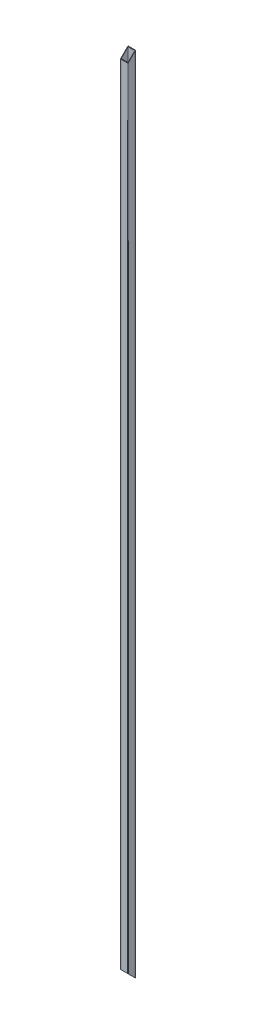
ISO-10303-21;
HEADER;
FILE_DESCRIPTION(('STEP AP214'),'2;1');
FILE_NAME('part.step','',(''),(''),'','','');
FILE_SCHEMA(('AUTOMOTIVE_DESIGN { 1 0 10303 214 1 1 1 1 }'));
ENDSEC;
DATA;
#1=APPLICATION_CONTEXT('core data for automotive mechanical design processes');
#2=APPLICATION_PROTOCOL_DEFINITION('international standard','automotive_design',2000,#1);
#3=PRODUCT_CONTEXT('',#1,'mechanical');
#4=PRODUCT('Part','Part','',(#3));
#5=PRODUCT_RELATED_PRODUCT_CATEGORY('part','',(#4));
#6=PRODUCT_DEFINITION_FORMATION('','',#4);
#7=PRODUCT_DEFINITION_CONTEXT('part definition',#1,'design');
#8=PRODUCT_DEFINITION('design','',#6,#7);
#9=PRODUCT_DEFINITION_SHAPE('','',#8);
#10=(LENGTH_UNIT() NAMED_UNIT(*) SI_UNIT(.MILLI.,.METRE.));
#11=(NAMED_UNIT(*) PLANE_ANGLE_UNIT() SI_UNIT($,.RADIAN.));
#12=(NAMED_UNIT(*) SI_UNIT($,.STERADIAN.) SOLID_ANGLE_UNIT());
#13=UNCERTAINTY_MEASURE_WITH_UNIT(LENGTH_MEASURE(1.E-05),#10,'distance_accuracy_value','');
#14=(GEOMETRIC_REPRESENTATION_CONTEXT(3) GLOBAL_UNCERTAINTY_ASSIGNED_CONTEXT((#13)) GLOBAL_UNIT_ASSIGNED_CONTEXT((#10,
#11,#12)) REPRESENTATION_CONTEXT('',''));
#15=CARTESIAN_POINT('',(0.,0.,0.));
#16=DIRECTION('',(0.,0.,1.));
#17=DIRECTION('',(1.,0.,0.));
#18=AXIS2_PLACEMENT_3D('',#15,#16,#17);
#19=CARTESIAN_POINT('',(16.,4240.,18.));
#20=DIRECTION('',(0.,0.,-1.));
#21=DIRECTION('',(-1.,0.,0.));
#22=AXIS2_PLACEMENT_3D('',#19,#20,#21);
#23=PLANE('',#22);
#24=DIRECTION('',(-1.,0.,0.));
#25=VECTOR('',#24,1.);
#26=CARTESIAN_POINT('',(16.,4202.,18.));
#27=LINE('',#26,#25);
#28=CARTESIAN_POINT('',(16.,4202.,18.));
#29=VERTEX_POINT('',#28);
#30=CARTESIAN_POINT('',(-16.,4202.,18.));
#31=VERTEX_POINT('',#30);
#32=EDGE_CURVE('E11',#29,#31,#27,.T.);
#33=ORIENTED_EDGE('',*,*,#32,.F.);
#34=DIRECTION('',(0.,-1.,0.));
#35=VECTOR('',#34,1.);
#36=CARTESIAN_POINT('',(16.,4240.,18.));
#37=LINE('',#36,#35);
#38=CARTESIAN_POINT('',(16.,38.0000000000003,18.));
#39=VERTEX_POINT('',#38);
#40=EDGE_CURVE('E201',#29,#39,#37,.T.);
#41=ORIENTED_EDGE('',*,*,#40,.T.);
#42=DIRECTION('',(1.,0.,0.));
#43=VECTOR('',#42,1.);
#44=CARTESIAN_POINT('',(16.0000000000004,38.0000000000003,18.));
#45=LINE('',#44,#43);
#46=CARTESIAN_POINT('',(-16.,38.0000000000003,18.));
#47=VERTEX_POINT('',#46);
#48=EDGE_CURVE('E43',#47,#39,#45,.T.);
#49=ORIENTED_EDGE('',*,*,#48,.F.);
#50=DIRECTION('',(0.,-1.,0.));
#51=VECTOR('',#50,1.);
#52=CARTESIAN_POINT('',(-16.,4240.,18.));
#53=LINE('',#52,#51);
#54=EDGE_CURVE('E206',#31,#47,#53,.T.);
#55=ORIENTED_EDGE('',*,*,#54,.F.);
#56=EDGE_LOOP('',(#33,#41,#49,#55));
#57=FACE_BOUND('',#56,.T.);
#58=ADVANCED_FACE('F35',(#57),#23,.T.);
#59=CARTESIAN_POINT('',(-16.,4240.,16.));
#60=DIRECTION('',(0.,-1.,0.));
#61=DIRECTION('',(0.,0.,-1.));
#62=AXIS2_PLACEMENT_3D('',#59,#60,#61);
#63=CYLINDRICAL_SURFACE('',#62,2.);
#64=CARTESIAN_POINT('',(-16.,4204.,16.));
#65=DIRECTION('',(0.,-0.70710678118654,-0.707106781186556));
#66=DIRECTION('',(0.,-0.707106781186556,0.707106781186539));
#67=AXIS2_PLACEMENT_3D('',#64,#65,#66);
#68=ELLIPSE('',#67,2.82842712474622,2.);
#69=CARTESIAN_POINT('',(-18.,4204.,16.));
#70=VERTEX_POINT('',#69);
#71=EDGE_CURVE('E270',#31,#70,#68,.T.);
#72=ORIENTED_EDGE('',*,*,#71,.F.);
#73=ORIENTED_EDGE('',*,*,#54,.T.);
#74=CARTESIAN_POINT('',(-16.,35.9999999999996,16.));
#75=DIRECTION('',(0.,0.707106781186544,-0.707106781186551));
#76=DIRECTION('',(0.,-0.707106781186551,-0.707106781186544));
#77=AXIS2_PLACEMENT_3D('',#74,#75,#76);
#78=ELLIPSE('',#77,2.8284271247462,2.);
#79=CARTESIAN_POINT('',(-18.,35.9999999999996,16.));
#80=VERTEX_POINT('',#79);
#81=EDGE_CURVE('E191',#80,#47,#78,.T.);
#82=ORIENTED_EDGE('',*,*,#81,.F.);
#83=DIRECTION('',(0.,-1.,0.));
#84=VECTOR('',#83,1.);
#85=CARTESIAN_POINT('',(-18.,4240.,16.));
#86=LINE('',#85,#84);
#87=EDGE_CURVE('E209',#70,#80,#86,.T.);
#88=ORIENTED_EDGE('',*,*,#87,.F.);
#89=EDGE_LOOP('',(#72,#73,#82,#88));
#90=FACE_BOUND('',#89,.T.);
#91=ADVANCED_FACE('F309',(#90),#63,.F.);
#92=CARTESIAN_POINT('',(-18.,4240.,16.));
#93=DIRECTION('',(1.,0.,0.));
#94=DIRECTION('',(0.,0.,-1.));
#95=AXIS2_PLACEMENT_3D('',#92,#93,#94);
#96=PLANE('',#95);
#97=DIRECTION('',(0.,0.707106781186556,-0.707106781186539));
#98=VECTOR('',#97,1.);
#99=CARTESIAN_POINT('',(-18.,4222.,-2.00000000000042));
#100=LINE('',#99,#98);
#101=CARTESIAN_POINT('',(-18.,4236.,-16.));
#102=VERTEX_POINT('',#101);
#103=EDGE_CURVE('E272',#70,#102,#100,.T.);
#104=ORIENTED_EDGE('',*,*,#103,.F.);
#105=ORIENTED_EDGE('',*,*,#87,.T.);
#106=DIRECTION('',(0.,0.707106781186551,0.707106781186544));
#107=VECTOR('',#106,1.);
#108=CARTESIAN_POINT('',(-18.,2138.00000000002,2118.));
#109=LINE('',#108,#107);
#110=CARTESIAN_POINT('',(-18.,4.,-16.));
#111=VERTEX_POINT('',#110);
#112=EDGE_CURVE('E258',#111,#80,#109,.T.);
#113=ORIENTED_EDGE('',*,*,#112,.F.);
#114=DIRECTION('',(0.,-1.,0.));
#115=VECTOR('',#114,1.);
#116=CARTESIAN_POINT('',(-18.,4240.,-16.));
#117=LINE('',#116,#115);
#118=EDGE_CURVE('E218',#102,#111,#117,.T.);
#119=ORIENTED_EDGE('',*,*,#118,.F.);
#120=EDGE_LOOP('',(#104,#105,#113,#119));
#121=FACE_BOUND('',#120,.T.);
#122=ADVANCED_FACE('F314',(#121),#96,.T.);
#123=CARTESIAN_POINT('',(-16.,4240.,-16.));
#124=DIRECTION('',(0.,-1.,0.));
#125=DIRECTION('',(0.,0.,-1.));
#126=AXIS2_PLACEMENT_3D('',#123,#124,#125);
#127=CYLINDRICAL_SURFACE('',#126,2.);
#128=CARTESIAN_POINT('',(-16.,4236.,-16.));
#129=DIRECTION('',(0.,-0.70710678118654,-0.707106781186556));
#130=DIRECTION('',(0.,-0.707106781186556,0.707106781186539));
#131=AXIS2_PLACEMENT_3D('',#128,#129,#130);
#132=ELLIPSE('',#131,2.82842712474622,2.);
#133=CARTESIAN_POINT('',(-16.,4238.,-18.));
#134=VERTEX_POINT('',#133);
#135=EDGE_CURVE('E274',#102,#134,#132,.T.);
#136=ORIENTED_EDGE('',*,*,#135,.F.);
#137=ORIENTED_EDGE('',*,*,#118,.T.);
#138=CARTESIAN_POINT('',(-16.,3.99999999999956,-16.));
#139=DIRECTION('',(0.,0.707106781186544,-0.707106781186551));
#140=DIRECTION('',(0.,-0.707106781186551,-0.707106781186544));
#141=AXIS2_PLACEMENT_3D('',#138,#139,#140);
#142=ELLIPSE('',#141,2.8284271247462,2.);
#143=CARTESIAN_POINT('',(-16.,1.99999999999889,-18.));
#144=VERTEX_POINT('',#143);
#145=EDGE_CURVE('E260',#144,#111,#142,.T.);
#146=ORIENTED_EDGE('',*,*,#145,.F.);
#147=DIRECTION('',(0.,-1.,0.));
#148=VECTOR('',#147,1.);
#149=CARTESIAN_POINT('',(-16.,4240.,-18.));
#150=LINE('',#149,#148);
#151=EDGE_CURVE('E221',#134,#144,#150,.T.);
#152=ORIENTED_EDGE('',*,*,#151,.F.);
#153=EDGE_LOOP('',(#136,#137,#146,#152));
#154=FACE_BOUND('',#153,.T.);
#155=ADVANCED_FACE('F320',(#154),#127,.F.);
#156=CARTESIAN_POINT('',(16.,4240.,-18.));
#157=DIRECTION('',(0.,0.,1.));
#158=DIRECTION('',(1.,0.,0.));
#159=AXIS2_PLACEMENT_3D('',#156,#157,#158);
#160=PLANE('',#159);
#161=DIRECTION('',(1.,0.,0.));
#162=VECTOR('',#161,1.);
#163=CARTESIAN_POINT('',(16.,4238.,-18.));
#164=LINE('',#163,#162);
#165=CARTESIAN_POINT('',(16.,4238.,-18.));
#166=VERTEX_POINT('',#165);
#167=EDGE_CURVE('E276',#134,#166,#164,.T.);
#168=ORIENTED_EDGE('',*,*,#167,.F.);
#169=ORIENTED_EDGE('',*,*,#151,.T.);
#170=DIRECTION('',(-1.,0.,0.));
#171=VECTOR('',#170,1.);
#172=CARTESIAN_POINT('',(16.0000000000004,1.99999999999978,-18.));
#173=LINE('',#172,#171);
#174=CARTESIAN_POINT('',(16.,1.99999999999978,-18.));
#175=VERTEX_POINT('',#174);
#176=EDGE_CURVE('E262',#175,#144,#173,.T.);
#177=ORIENTED_EDGE('',*,*,#176,.F.);
#178=DIRECTION('',(0.,-1.,0.));
#179=VECTOR('',#178,1.);
#180=CARTESIAN_POINT('',(16.,4240.,-18.));
#181=LINE('',#180,#179);
#182=EDGE_CURVE('E224',#166,#175,#181,.T.);
#183=ORIENTED_EDGE('',*,*,#182,.F.);
#184=EDGE_LOOP('',(#168,#169,#177,#183));
#185=FACE_BOUND('',#184,.T.);
#186=ADVANCED_FACE('F324',(#185),#160,.T.);
#187=CARTESIAN_POINT('',(16.,4240.,-16.));
#188=DIRECTION('',(0.,-1.,0.));
#189=DIRECTION('',(0.,0.,-1.));
#190=AXIS2_PLACEMENT_3D('',#187,#188,#189);
#191=CYLINDRICAL_SURFACE('',#190,2.);
#192=CARTESIAN_POINT('',(16.,4236.,-16.));
#193=DIRECTION('',(0.,-0.70710678118654,-0.707106781186556));
#194=DIRECTION('',(0.,-0.707106781186556,0.707106781186539));
#195=AXIS2_PLACEMENT_3D('',#192,#193,#194);
#196=ELLIPSE('',#195,2.82842712474622,2.);
#197=CARTESIAN_POINT('',(18.,4236.,-16.));
#198=VERTEX_POINT('',#197);
#199=EDGE_CURVE('E278',#166,#198,#196,.T.);
#200=ORIENTED_EDGE('',*,*,#199,.F.);
#201=ORIENTED_EDGE('',*,*,#182,.T.);
#202=CARTESIAN_POINT('',(16.,3.99999999999956,-16.));
#203=DIRECTION('',(0.,0.707106781186544,-0.707106781186551));
#204=DIRECTION('',(0.,-0.707106781186551,-0.707106781186544));
#205=AXIS2_PLACEMENT_3D('',#202,#203,#204);
#206=ELLIPSE('',#205,2.8284271247462,2.);
#207=CARTESIAN_POINT('',(18.,3.99999999999956,-16.));
#208=VERTEX_POINT('',#207);
#209=EDGE_CURVE('E264',#208,#175,#206,.T.);
#210=ORIENTED_EDGE('',*,*,#209,.F.);
#211=DIRECTION('',(0.,-1.,0.));
#212=VECTOR('',#211,1.);
#213=CARTESIAN_POINT('',(18.,4240.,-16.));
#214=LINE('',#213,#212);
#215=EDGE_CURVE('E227',#198,#208,#214,.T.);
#216=ORIENTED_EDGE('',*,*,#215,.F.);
#217=EDGE_LOOP('',(#200,#201,#210,#216));
#218=FACE_BOUND('',#217,.T.);
#219=ADVANCED_FACE('F328',(#218),#191,.F.);
#220=CARTESIAN_POINT('',(18.,4240.,16.));
#221=DIRECTION('',(-1.,0.,0.));
#222=DIRECTION('',(0.,0.,1.));
#223=AXIS2_PLACEMENT_3D('',#220,#221,#222);
#224=PLANE('',#223);
#225=DIRECTION('',(0.,-0.707106781186556,0.707106781186539));
#226=VECTOR('',#225,1.);
#227=CARTESIAN_POINT('',(18.,4222.,-2.00000000000043));
#228=LINE('',#227,#226);
#229=CARTESIAN_POINT('',(18.,4204.,16.));
#230=VERTEX_POINT('',#229);
#231=EDGE_CURVE('E280',#198,#230,#228,.T.);
#232=ORIENTED_EDGE('',*,*,#231,.F.);
#233=ORIENTED_EDGE('',*,*,#215,.T.);
#234=DIRECTION('',(0.,-0.707106781186551,-0.707106781186544));
#235=VECTOR('',#234,1.);
#236=CARTESIAN_POINT('',(18.,2138.00000000002,2118.));
#237=LINE('',#236,#235);
#238=CARTESIAN_POINT('',(18.,36.,16.));
#239=VERTEX_POINT('',#238);
#240=EDGE_CURVE('E203',#239,#208,#237,.T.);
#241=ORIENTED_EDGE('',*,*,#240,.F.);
#242=DIRECTION('',(0.,-1.,0.));
#243=VECTOR('',#242,1.);
#244=CARTESIAN_POINT('',(18.,4240.,16.));
#245=LINE('',#244,#243);
#246=EDGE_CURVE('E168',#230,#239,#245,.T.);
#247=ORIENTED_EDGE('',*,*,#246,.F.);
#248=EDGE_LOOP('',(#232,#233,#241,#247));
#249=FACE_BOUND('',#248,.T.);
#250=ADVANCED_FACE('F332',(#249),#224,.T.);
#251=CARTESIAN_POINT('',(16.,4240.,16.));
#252=DIRECTION('',(0.,-1.,0.));
#253=DIRECTION('',(0.,0.,-1.));
#254=AXIS2_PLACEMENT_3D('',#251,#252,#253);
#255=CYLINDRICAL_SURFACE('',#254,2.);
#256=CARTESIAN_POINT('',(16.,4204.,16.));
#257=DIRECTION('',(0.,-0.70710678118654,-0.707106781186556));
#258=DIRECTION('',(0.,-0.707106781186556,0.707106781186539));
#259=AXIS2_PLACEMENT_3D('',#256,#257,#258);
#260=ELLIPSE('',#259,2.82842712474622,2.);
#261=EDGE_CURVE('E282',#230,#29,#260,.T.);
#262=ORIENTED_EDGE('',*,*,#261,.F.);
#263=ORIENTED_EDGE('',*,*,#246,.T.);
#264=CARTESIAN_POINT('',(16.,35.9999999999996,16.));
#265=DIRECTION('',(0.,0.707106781186544,-0.707106781186551));
#266=DIRECTION('',(0.,-0.707106781186551,-0.707106781186544));
#267=AXIS2_PLACEMENT_3D('',#264,#265,#266);
#268=ELLIPSE('',#267,2.8284271247462,2.);
#269=EDGE_CURVE('E188',#39,#239,#268,.T.);
#270=ORIENTED_EDGE('',*,*,#269,.F.);
#271=ORIENTED_EDGE('',*,*,#40,.F.);
#272=EDGE_LOOP('',(#262,#263,#270,#271));
#273=FACE_BOUND('',#272,.T.);
#274=ADVANCED_FACE('F200',(#273),#255,.F.);
#275=CARTESIAN_POINT('',(-20.,40.0000000000004,20.));
#276=DIRECTION('',(0.,0.707106781186544,-0.707106781186551));
#277=DIRECTION('',(0.,0.707106781186551,0.707106781186544));
#278=AXIS2_PLACEMENT_3D('',#275,#276,#277);
#279=PLANE('',#278);
#280=ORIENTED_EDGE('',*,*,#269,.T.);
#281=ORIENTED_EDGE('',*,*,#240,.T.);
#282=ORIENTED_EDGE('',*,*,#209,.T.);
#283=ORIENTED_EDGE('',*,*,#176,.T.);
#284=ORIENTED_EDGE('',*,*,#145,.T.);
#285=ORIENTED_EDGE('',*,*,#112,.T.);
#286=ORIENTED_EDGE('',*,*,#81,.T.);
#287=ORIENTED_EDGE('',*,*,#48,.T.);
#288=EDGE_LOOP('',(#280,#281,#282,#283,#284,#285,#286,#287));
#289=FACE_BOUND('',#288,.T.);
#290=DIRECTION('',(1.,0.,0.));
#291=VECTOR('',#290,1.);
#292=CARTESIAN_POINT('',(-20.,40.0000000000004,20.));
#293=LINE('',#292,#291);
#294=CARTESIAN_POINT('',(-18.,40.0000000000004,20.));
#295=VERTEX_POINT('',#294);
#296=CARTESIAN_POINT('',(18.,40.,20.));
#297=VERTEX_POINT('',#296);
#298=EDGE_CURVE('E247',#295,#297,#293,.T.);
#299=ORIENTED_EDGE('',*,*,#298,.F.);
#300=CARTESIAN_POINT('',(-18.,38.0000000000003,18.));
#301=DIRECTION('',(0.,0.707106781186544,-0.707106781186551));
#302=DIRECTION('',(0.,-0.707106781186551,-0.707106781186544));
#303=AXIS2_PLACEMENT_3D('',#300,#301,#302);
#304=ELLIPSE('',#303,2.8284271247462,2.);
#305=CARTESIAN_POINT('',(-20.,38.0000000000003,18.));
#306=VERTEX_POINT('',#305);
#307=EDGE_CURVE('E157',#306,#295,#304,.T.);
#308=ORIENTED_EDGE('',*,*,#307,.F.);
#309=DIRECTION('',(0.,0.707106781186551,0.707106781186544));
#310=VECTOR('',#309,1.);
#311=CARTESIAN_POINT('',(-20.,40.0000000000004,20.));
#312=LINE('',#311,#310);
#313=CARTESIAN_POINT('',(-20.,1.99999999999979,-18.0000000000002));
#314=VERTEX_POINT('',#313);
#315=EDGE_CURVE('E151',#314,#306,#312,.T.);
#316=ORIENTED_EDGE('',*,*,#315,.F.);
#317=CARTESIAN_POINT('',(-18.,1.99999999999978,-18.));
#318=DIRECTION('',(0.,0.707106781186544,-0.707106781186551));
#319=DIRECTION('',(0.,-0.707106781186551,-0.707106781186544));
#320=AXIS2_PLACEMENT_3D('',#317,#318,#319);
#321=ELLIPSE('',#320,2.8284271247462,2.);
#322=CARTESIAN_POINT('',(-18.,0.,-20.));
#323=VERTEX_POINT('',#322);
#324=EDGE_CURVE('E145',#323,#314,#321,.T.);
#325=ORIENTED_EDGE('',*,*,#324,.F.);
#326=DIRECTION('',(-1.,0.,0.));
#327=VECTOR('',#326,1.);
#328=CARTESIAN_POINT('',(-18.,0.,-20.));
#329=LINE('',#328,#327);
#330=CARTESIAN_POINT('',(18.,0.,-20.));
#331=VERTEX_POINT('',#330);
#332=EDGE_CURVE('E148',#331,#323,#329,.T.);
#333=ORIENTED_EDGE('',*,*,#332,.F.);
#334=CARTESIAN_POINT('',(18.,1.99999999999978,-18.));
#335=DIRECTION('',(0.,0.707106781186544,-0.707106781186551));
#336=DIRECTION('',(0.,-0.707106781186551,-0.707106781186544));
#337=AXIS2_PLACEMENT_3D('',#334,#335,#336);
#338=ELLIPSE('',#337,2.82842712474621,2.);
#339=CARTESIAN_POINT('',(20.,1.99999999999975,-18.0000000000002));
#340=VERTEX_POINT('',#339);
#341=EDGE_CURVE('E156',#340,#331,#338,.T.);
#342=ORIENTED_EDGE('',*,*,#341,.F.);
#343=DIRECTION('',(0.,0.707106781186551,0.707106781186544));
#344=VECTOR('',#343,1.);
#345=CARTESIAN_POINT('',(20.,40.0000000000004,20.));
#346=LINE('',#345,#344);
#347=CARTESIAN_POINT('',(20.,38.,17.9999999999996));
#348=VERTEX_POINT('',#347);
#349=EDGE_CURVE('E248',#340,#348,#346,.T.);
#350=ORIENTED_EDGE('',*,*,#349,.T.);
#351=CARTESIAN_POINT('',(18.,38.0000000000003,18.));
#352=DIRECTION('',(0.,0.707106781186544,-0.707106781186551));
#353=DIRECTION('',(0.,-0.707106781186551,-0.707106781186544));
#354=AXIS2_PLACEMENT_3D('',#351,#352,#353);
#355=ELLIPSE('',#354,2.8284271247462,2.);
#356=EDGE_CURVE('E58',#297,#348,#355,.T.);
#357=ORIENTED_EDGE('',*,*,#356,.F.);
#358=EDGE_LOOP('',(#299,#308,#316,#325,#333,#342,#350,#357));
#359=FACE_BOUND('',#358,.T.);
#360=ADVANCED_FACE('F147',(#289,#359),#279,.F.);
#361=CARTESIAN_POINT('',(-20.,4200.,20.));
#362=DIRECTION('',(0.,-0.70710678118654,-0.707106781186556));
#363=DIRECTION('',(0.,0.707106781186556,-0.707106781186539));
#364=AXIS2_PLACEMENT_3D('',#361,#362,#363);
#365=PLANE('',#364);
#366=ORIENTED_EDGE('',*,*,#261,.T.);
#367=ORIENTED_EDGE('',*,*,#32,.T.);
#368=ORIENTED_EDGE('',*,*,#71,.T.);
#369=ORIENTED_EDGE('',*,*,#103,.T.);
#370=ORIENTED_EDGE('',*,*,#135,.T.);
#371=ORIENTED_EDGE('',*,*,#167,.T.);
#372=ORIENTED_EDGE('',*,*,#199,.T.);
#373=ORIENTED_EDGE('',*,*,#231,.T.);
#374=EDGE_LOOP('',(#366,#367,#368,#369,#370,#371,#372,#373));
#375=FACE_BOUND('',#374,.T.);
#376=DIRECTION('',(0.,0.707106781186556,-0.707106781186539));
#377=VECTOR('',#376,1.);
#378=CARTESIAN_POINT('',(20.,4200.,20.));
#379=LINE('',#378,#377);
#380=CARTESIAN_POINT('',(20.,4202.,18.0000000000001));
#381=VERTEX_POINT('',#380);
#382=CARTESIAN_POINT('',(20.,4238.,-18.));
#383=VERTEX_POINT('',#382);
#384=EDGE_CURVE('E250',#381,#383,#379,.T.);
#385=ORIENTED_EDGE('',*,*,#384,.T.);
#386=CARTESIAN_POINT('',(18.,4238.,-18.));
#387=DIRECTION('',(0.,-0.70710678118654,-0.707106781186556));
#388=DIRECTION('',(0.,-0.707106781186556,0.707106781186539));
#389=AXIS2_PLACEMENT_3D('',#386,#387,#388);
#390=ELLIPSE('',#389,2.82842712474622,2.);
#391=CARTESIAN_POINT('',(18.,4240.,-20.));
#392=VERTEX_POINT('',#391);
#393=EDGE_CURVE('E212',#392,#383,#390,.T.);
#394=ORIENTED_EDGE('',*,*,#393,.F.);
#395=DIRECTION('',(-1.,0.,0.));
#396=VECTOR('',#395,1.);
#397=CARTESIAN_POINT('',(-18.,4240.,-20.));
#398=LINE('',#397,#396);
#399=CARTESIAN_POINT('',(-18.,4240.,-20.));
#400=VERTEX_POINT('',#399);
#401=EDGE_CURVE('E167',#392,#400,#398,.T.);
#402=ORIENTED_EDGE('',*,*,#401,.T.);
#403=CARTESIAN_POINT('',(-18.,4238.,-18.));
#404=DIRECTION('',(0.,-0.70710678118654,-0.707106781186556));
#405=DIRECTION('',(0.,-0.707106781186556,0.707106781186539));
#406=AXIS2_PLACEMENT_3D('',#403,#404,#405);
#407=ELLIPSE('',#406,2.82842712474622,2.);
#408=CARTESIAN_POINT('',(-20.,4238.,-17.9999999999997));
#409=VERTEX_POINT('',#408);
#410=EDGE_CURVE('E172',#409,#400,#407,.T.);
#411=ORIENTED_EDGE('',*,*,#410,.F.);
#412=DIRECTION('',(0.,0.707106781186556,-0.707106781186539));
#413=VECTOR('',#412,1.);
#414=CARTESIAN_POINT('',(-20.,4200.,20.));
#415=LINE('',#414,#413);
#416=CARTESIAN_POINT('',(-20.,4202.,18.));
#417=VERTEX_POINT('',#416);
#418=EDGE_CURVE('E246',#417,#409,#415,.T.);
#419=ORIENTED_EDGE('',*,*,#418,.F.);
#420=CARTESIAN_POINT('',(-18.,4202.,18.));
#421=DIRECTION('',(0.,-0.70710678118654,-0.707106781186556));
#422=DIRECTION('',(0.,-0.707106781186556,0.707106781186539));
#423=AXIS2_PLACEMENT_3D('',#420,#421,#422);
#424=ELLIPSE('',#423,2.82842712474622,2.);
#425=CARTESIAN_POINT('',(-18.,4200.,20.));
#426=VERTEX_POINT('',#425);
#427=EDGE_CURVE('E50',#426,#417,#424,.T.);
#428=ORIENTED_EDGE('',*,*,#427,.F.);
#429=DIRECTION('',(1.,0.,0.));
#430=VECTOR('',#429,1.);
#431=CARTESIAN_POINT('',(-20.,4200.,20.));
#432=LINE('',#431,#430);
#433=CARTESIAN_POINT('',(18.,4200.,20.));
#434=VERTEX_POINT('',#433);
#435=EDGE_CURVE('E254',#426,#434,#432,.T.);
#436=ORIENTED_EDGE('',*,*,#435,.T.);
#437=CARTESIAN_POINT('',(18.,4202.,18.));
#438=DIRECTION('',(0.,-0.70710678118654,-0.707106781186556));
#439=DIRECTION('',(0.,-0.707106781186556,0.707106781186539));
#440=AXIS2_PLACEMENT_3D('',#437,#438,#439);
#441=ELLIPSE('',#440,2.82842712474622,2.);
#442=EDGE_CURVE('E207',#381,#434,#441,.T.);
#443=ORIENTED_EDGE('',*,*,#442,.F.);
#444=EDGE_LOOP('',(#385,#394,#402,#411,#419,#428,#436,#443));
#445=FACE_BOUND('',#444,.T.);
#446=ADVANCED_FACE('F299',(#375,#445),#365,.F.);
#447=CARTESIAN_POINT('',(18.,4240.,18.));
#448=DIRECTION('',(0.,-1.,0.));
#449=DIRECTION('',(0.,0.,-1.));
#450=AXIS2_PLACEMENT_3D('',#447,#448,#449);
#451=CYLINDRICAL_SURFACE('',#450,2.);
#452=DIRECTION('',(0.,-1.,0.));
#453=VECTOR('',#452,1.);
#454=CARTESIAN_POINT('',(20.,4240.,18.));
#455=LINE('',#454,#453);
#456=EDGE_CURVE('E183',#381,#348,#455,.T.);
#457=ORIENTED_EDGE('',*,*,#456,.F.);
#458=ORIENTED_EDGE('',*,*,#442,.T.);
#459=DIRECTION('',(0.,-1.,0.));
#460=VECTOR('',#459,1.);
#461=CARTESIAN_POINT('',(18.,4240.,20.));
#462=LINE('',#461,#460);
#463=EDGE_CURVE('E231',#434,#297,#462,.T.);
#464=ORIENTED_EDGE('',*,*,#463,.T.);
#465=ORIENTED_EDGE('',*,*,#356,.T.);
#466=EDGE_LOOP('',(#457,#458,#464,#465));
#467=FACE_BOUND('',#466,.T.);
#468=ADVANCED_FACE('F37',(#467),#451,.T.);
#469=CARTESIAN_POINT('',(20.,4240.,-18.));
#470=DIRECTION('',(-1.,0.,0.));
#471=DIRECTION('',(0.,0.,1.));
#472=AXIS2_PLACEMENT_3D('',#469,#470,#471);
#473=PLANE('',#472);
#474=DIRECTION('',(0.,-1.,0.));
#475=VECTOR('',#474,1.);
#476=CARTESIAN_POINT('',(20.,4240.,-18.));
#477=LINE('',#476,#475);
#478=EDGE_CURVE('E175',#383,#340,#477,.T.);
#479=ORIENTED_EDGE('',*,*,#478,.F.);
#480=ORIENTED_EDGE('',*,*,#384,.F.);
#481=ORIENTED_EDGE('',*,*,#456,.T.);
#482=ORIENTED_EDGE('',*,*,#349,.F.);
#483=EDGE_LOOP('',(#479,#480,#481,#482));
#484=FACE_BOUND('',#483,.T.);
#485=ADVANCED_FACE('F292',(#484),#473,.F.);
#486=CARTESIAN_POINT('',(18.,4240.,-18.));
#487=DIRECTION('',(0.,-1.,0.));
#488=DIRECTION('',(0.,0.,-1.));
#489=AXIS2_PLACEMENT_3D('',#486,#487,#488);
#490=CYLINDRICAL_SURFACE('',#489,2.);
#491=DIRECTION('',(0.,-1.,0.));
#492=VECTOR('',#491,1.);
#493=CARTESIAN_POINT('',(18.,4240.,-20.));
#494=LINE('',#493,#492);
#495=EDGE_CURVE('E166',#392,#331,#494,.T.);
#496=ORIENTED_EDGE('',*,*,#495,.F.);
#497=ORIENTED_EDGE('',*,*,#393,.T.);
#498=ORIENTED_EDGE('',*,*,#478,.T.);
#499=ORIENTED_EDGE('',*,*,#341,.T.);
#500=EDGE_LOOP('',(#496,#497,#498,#499));
#501=FACE_BOUND('',#500,.T.);
#502=ADVANCED_FACE('F288',(#501),#490,.T.);
#503=CARTESIAN_POINT('',(-18.,4240.,-20.));
#504=DIRECTION('',(0.,0.,1.));
#505=DIRECTION('',(1.,0.,0.));
#506=AXIS2_PLACEMENT_3D('',#503,#504,#505);
#507=PLANE('',#506);
#508=ORIENTED_EDGE('',*,*,#332,.T.);
#509=DIRECTION('',(0.,-1.,0.));
#510=VECTOR('',#509,1.);
#511=CARTESIAN_POINT('',(-18.,4240.,-20.));
#512=LINE('',#511,#510);
#513=EDGE_CURVE('E164',#400,#323,#512,.T.);
#514=ORIENTED_EDGE('',*,*,#513,.F.);
#515=ORIENTED_EDGE('',*,*,#401,.F.);
#516=ORIENTED_EDGE('',*,*,#495,.T.);
#517=EDGE_LOOP('',(#508,#514,#515,#516));
#518=FACE_BOUND('',#517,.T.);
#519=ADVANCED_FACE('F162',(#518),#507,.F.);
#520=CARTESIAN_POINT('',(-18.,4240.,-18.));
#521=DIRECTION('',(0.,-1.,0.));
#522=DIRECTION('',(0.,0.,-1.));
#523=AXIS2_PLACEMENT_3D('',#520,#521,#522);
#524=CYLINDRICAL_SURFACE('',#523,2.);
#525=DIRECTION('',(0.,-1.,0.));
#526=VECTOR('',#525,1.);
#527=CARTESIAN_POINT('',(-20.,4240.,-18.));
#528=LINE('',#527,#526);
#529=EDGE_CURVE('E173',#409,#314,#528,.T.);
#530=ORIENTED_EDGE('',*,*,#529,.F.);
#531=ORIENTED_EDGE('',*,*,#410,.T.);
#532=ORIENTED_EDGE('',*,*,#513,.T.);
#533=ORIENTED_EDGE('',*,*,#324,.T.);
#534=EDGE_LOOP('',(#530,#531,#532,#533));
#535=FACE_BOUND('',#534,.T.);
#536=ADVANCED_FACE('F171',(#535),#524,.T.);
#537=CARTESIAN_POINT('',(-20.,4240.,-18.));
#538=DIRECTION('',(1.,0.,0.));
#539=DIRECTION('',(0.,0.,-1.));
#540=AXIS2_PLACEMENT_3D('',#537,#538,#539);
#541=PLANE('',#540);
#542=DIRECTION('',(0.,-1.,0.));
#543=VECTOR('',#542,1.);
#544=CARTESIAN_POINT('',(-20.,4240.,18.));
#545=LINE('',#544,#543);
#546=EDGE_CURVE('E177',#417,#306,#545,.T.);
#547=ORIENTED_EDGE('',*,*,#546,.F.);
#548=ORIENTED_EDGE('',*,*,#418,.T.);
#549=ORIENTED_EDGE('',*,*,#529,.T.);
#550=ORIENTED_EDGE('',*,*,#315,.T.);
#551=EDGE_LOOP('',(#547,#548,#549,#550));
#552=FACE_BOUND('',#551,.T.);
#553=ADVANCED_FACE('F245',(#552),#541,.F.);
#554=CARTESIAN_POINT('',(-18.,4240.,18.));
#555=DIRECTION('',(0.,-1.,0.));
#556=DIRECTION('',(0.,0.,-1.));
#557=AXIS2_PLACEMENT_3D('',#554,#555,#556);
#558=CYLINDRICAL_SURFACE('',#557,2.);
#559=DIRECTION('',(0.,-1.,0.));
#560=VECTOR('',#559,1.);
#561=CARTESIAN_POINT('',(-18.,4240.,20.));
#562=LINE('',#561,#560);
#563=EDGE_CURVE('E235',#426,#295,#562,.T.);
#564=ORIENTED_EDGE('',*,*,#563,.F.);
#565=ORIENTED_EDGE('',*,*,#427,.T.);
#566=ORIENTED_EDGE('',*,*,#546,.T.);
#567=ORIENTED_EDGE('',*,*,#307,.T.);
#568=EDGE_LOOP('',(#564,#565,#566,#567));
#569=FACE_BOUND('',#568,.T.);
#570=ADVANCED_FACE('F242',(#569),#558,.T.);
#571=CARTESIAN_POINT('',(-18.,4240.,20.));
#572=DIRECTION('',(0.,0.,-1.));
#573=DIRECTION('',(-1.,0.,0.));
#574=AXIS2_PLACEMENT_3D('',#571,#572,#573);
#575=PLANE('',#574);
#576=ORIENTED_EDGE('',*,*,#463,.F.);
#577=ORIENTED_EDGE('',*,*,#435,.F.);
#578=ORIENTED_EDGE('',*,*,#563,.T.);
#579=ORIENTED_EDGE('',*,*,#298,.T.);
#580=EDGE_LOOP('',(#576,#577,#578,#579));
#581=FACE_BOUND('',#580,.T.);
#582=ADVANCED_FACE('F297',(#581),#575,.F.);
#583=CLOSED_SHELL('',(#58,#91,#122,#155,#186,#219,#250,#274,#360,#446,#468,#485,#502,#519,#536,
#553,#570,#582));
#584=MANIFOLD_SOLID_BREP('B2',#583);
#585=ADVANCED_BREP_SHAPE_REPRESENTATION('',(#18,#584),#14);
#586=SHAPE_DEFINITION_REPRESENTATION(#9,#585);
ENDSEC;
END-ISO-10303-21;
